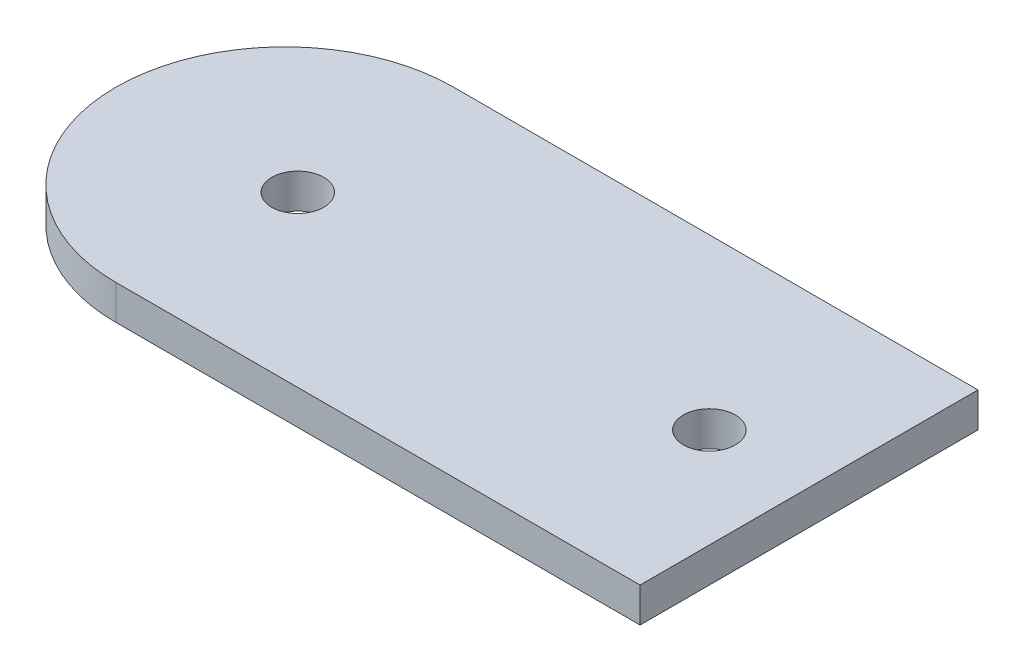
ISO-10303-21;
HEADER;
FILE_DESCRIPTION(('STEP AP214'),'2;1');
FILE_NAME('part.step','',(''),(''),'','','');
FILE_SCHEMA(('AUTOMOTIVE_DESIGN { 1 0 10303 214 1 1 1 1 }'));
ENDSEC;
DATA;
#1=APPLICATION_CONTEXT('core data for automotive mechanical design processes');
#2=APPLICATION_PROTOCOL_DEFINITION('international standard','automotive_design',2000,#1);
#3=PRODUCT_CONTEXT('',#1,'mechanical');
#4=PRODUCT('Part','Part','',(#3));
#5=PRODUCT_RELATED_PRODUCT_CATEGORY('part','',(#4));
#6=PRODUCT_DEFINITION_FORMATION('','',#4);
#7=PRODUCT_DEFINITION_CONTEXT('part definition',#1,'design');
#8=PRODUCT_DEFINITION('design','',#6,#7);
#9=PRODUCT_DEFINITION_SHAPE('','',#8);
#10=(LENGTH_UNIT() NAMED_UNIT(*) SI_UNIT(.MILLI.,.METRE.));
#11=(NAMED_UNIT(*) PLANE_ANGLE_UNIT() SI_UNIT($,.RADIAN.));
#12=(NAMED_UNIT(*) SI_UNIT($,.STERADIAN.) SOLID_ANGLE_UNIT());
#13=UNCERTAINTY_MEASURE_WITH_UNIT(LENGTH_MEASURE(1.E-05),#10,'distance_accuracy_value','');
#14=(GEOMETRIC_REPRESENTATION_CONTEXT(3) GLOBAL_UNCERTAINTY_ASSIGNED_CONTEXT((#13)) GLOBAL_UNIT_ASSIGNED_CONTEXT((#10,
#11,#12)) REPRESENTATION_CONTEXT('',''));
#15=CARTESIAN_POINT('',(0.,0.,0.));
#16=DIRECTION('',(0.,0.,1.));
#17=DIRECTION('',(1.,0.,0.));
#18=AXIS2_PLACEMENT_3D('',#15,#16,#17);
#19=CARTESIAN_POINT('',(0.,2.,9.75));
#20=DIRECTION('',(0.,0.,-1.));
#21=DIRECTION('',(-1.,0.,0.));
#22=AXIS2_PLACEMENT_3D('',#19,#20,#21);
#23=PLANE('',#22);
#24=DIRECTION('',(1.,0.,0.));
#25=VECTOR('',#24,1.);
#26=CARTESIAN_POINT('',(0.,2.,9.75));
#27=LINE('',#26,#25);
#28=CARTESIAN_POINT('',(-10.25,2.,9.75));
#29=VERTEX_POINT('',#28);
#30=CARTESIAN_POINT('',(20.,2.,9.75));
#31=VERTEX_POINT('',#30);
#32=EDGE_CURVE('E88',#29,#31,#27,.T.);
#33=ORIENTED_EDGE('',*,*,#32,.F.);
#34=DIRECTION('',(0.,-1.,0.));
#35=VECTOR('',#34,1.);
#36=CARTESIAN_POINT('',(-10.25,0.,9.75));
#37=LINE('',#36,#35);
#38=CARTESIAN_POINT('',(-10.25,0.,9.75));
#39=VERTEX_POINT('',#38);
#40=EDGE_CURVE('E11',#29,#39,#37,.T.);
#41=ORIENTED_EDGE('',*,*,#40,.T.);
#42=DIRECTION('',(1.,0.,0.));
#43=VECTOR('',#42,1.);
#44=CARTESIAN_POINT('',(0.,0.,9.75));
#45=LINE('',#44,#43);
#46=CARTESIAN_POINT('',(20.,0.,9.75));
#47=VERTEX_POINT('',#46);
#48=EDGE_CURVE('E110',#39,#47,#45,.T.);
#49=ORIENTED_EDGE('',*,*,#48,.T.);
#50=DIRECTION('',(0.,-1.,0.));
#51=VECTOR('',#50,1.);
#52=CARTESIAN_POINT('',(20.,2.,9.75));
#53=LINE('',#52,#51);
#54=EDGE_CURVE('E103',#31,#47,#53,.T.);
#55=ORIENTED_EDGE('',*,*,#54,.F.);
#56=EDGE_LOOP('',(#33,#41,#49,#55));
#57=FACE_BOUND('',#56,.T.);
#58=ADVANCED_FACE('F45',(#57),#23,.F.);
#59=CARTESIAN_POINT('',(20.,2.,0.));
#60=DIRECTION('',(-1.,0.,0.));
#61=DIRECTION('',(0.,0.,1.));
#62=AXIS2_PLACEMENT_3D('',#59,#60,#61);
#63=PLANE('',#62);
#64=DIRECTION('',(0.,0.,-1.));
#65=VECTOR('',#64,1.);
#66=CARTESIAN_POINT('',(20.,0.,0.));
#67=LINE('',#66,#65);
#68=CARTESIAN_POINT('',(20.,0.,-9.75));
#69=VERTEX_POINT('',#68);
#70=EDGE_CURVE('E151',#47,#69,#67,.T.);
#71=ORIENTED_EDGE('',*,*,#70,.T.);
#72=DIRECTION('',(0.,-1.,0.));
#73=VECTOR('',#72,1.);
#74=CARTESIAN_POINT('',(20.,2.,-9.75));
#75=LINE('',#74,#73);
#76=CARTESIAN_POINT('',(20.,2.,-9.75));
#77=VERTEX_POINT('',#76);
#78=EDGE_CURVE('E105',#77,#69,#75,.T.);
#79=ORIENTED_EDGE('',*,*,#78,.F.);
#80=DIRECTION('',(0.,0.,-1.));
#81=VECTOR('',#80,1.);
#82=CARTESIAN_POINT('',(20.,2.,0.));
#83=LINE('',#82,#81);
#84=EDGE_CURVE('E91',#31,#77,#83,.T.);
#85=ORIENTED_EDGE('',*,*,#84,.F.);
#86=ORIENTED_EDGE('',*,*,#54,.T.);
#87=EDGE_LOOP('',(#71,#79,#85,#86));
#88=FACE_BOUND('',#87,.T.);
#89=ADVANCED_FACE('F102',(#88),#63,.F.);
#90=CARTESIAN_POINT('',(0.,2.,-9.75));
#91=DIRECTION('',(0.,0.,-1.));
#92=DIRECTION('',(-1.,0.,0.));
#93=AXIS2_PLACEMENT_3D('',#90,#91,#92);
#94=PLANE('',#93);
#95=DIRECTION('',(1.,0.,0.));
#96=VECTOR('',#95,1.);
#97=CARTESIAN_POINT('',(0.,0.,-9.75));
#98=LINE('',#97,#96);
#99=CARTESIAN_POINT('',(-10.25,0.,-9.75));
#100=VERTEX_POINT('',#99);
#101=EDGE_CURVE('E135',#100,#69,#98,.T.);
#102=ORIENTED_EDGE('',*,*,#101,.F.);
#103=DIRECTION('',(0.,-1.,0.));
#104=VECTOR('',#103,1.);
#105=CARTESIAN_POINT('',(-10.25,2.,-9.75));
#106=LINE('',#105,#104);
#107=CARTESIAN_POINT('',(-10.25,2.,-9.75));
#108=VERTEX_POINT('',#107);
#109=EDGE_CURVE('E124',#100,#108,#106,.F.);
#110=ORIENTED_EDGE('',*,*,#109,.T.);
#111=DIRECTION('',(1.,0.,0.));
#112=VECTOR('',#111,1.);
#113=CARTESIAN_POINT('',(0.,2.,-9.75));
#114=LINE('',#113,#112);
#115=EDGE_CURVE('E107',#108,#77,#114,.T.);
#116=ORIENTED_EDGE('',*,*,#115,.T.);
#117=ORIENTED_EDGE('',*,*,#78,.T.);
#118=EDGE_LOOP('',(#102,#110,#116,#117));
#119=FACE_BOUND('',#118,.T.);
#120=ADVANCED_FACE('F134',(#119),#94,.T.);
#121=CARTESIAN_POINT('',(-9.5,2.,0.));
#122=DIRECTION('',(0.,-1.,0.));
#123=DIRECTION('',(0.,0.,-1.));
#124=AXIS2_PLACEMENT_3D('',#121,#122,#123);
#125=CYLINDRICAL_SURFACE('',#124,1.5);
#126=CARTESIAN_POINT('',(-9.5,2.,0.));
#127=DIRECTION('',(0.,1.,0.));
#128=DIRECTION('',(0.,0.,1.));
#129=AXIS2_PLACEMENT_3D('',#126,#127,#128);
#130=CIRCLE('',#129,1.5);
#131=CARTESIAN_POINT('',(-9.5,2.,1.5));
#132=VERTEX_POINT('',#131);
#133=EDGE_CURVE('E97',#132,#132,#130,.T.);
#134=ORIENTED_EDGE('',*,*,#133,.T.);
#135=EDGE_LOOP('',(#134));
#136=FACE_BOUND('',#135,.T.);
#137=CARTESIAN_POINT('',(-9.5,0.,0.));
#138=DIRECTION('',(0.,1.,0.));
#139=DIRECTION('',(0.,0.,1.));
#140=AXIS2_PLACEMENT_3D('',#137,#138,#139);
#141=CIRCLE('',#140,1.5);
#142=CARTESIAN_POINT('',(-9.5,0.,1.5));
#143=VERTEX_POINT('',#142);
#144=EDGE_CURVE('E145',#143,#143,#141,.T.);
#145=ORIENTED_EDGE('',*,*,#144,.F.);
#146=EDGE_LOOP('',(#145));
#147=FACE_BOUND('',#146,.T.);
#148=ADVANCED_FACE('F166',(#136,#147),#125,.F.);
#149=CARTESIAN_POINT('',(14.25,2.,0.));
#150=DIRECTION('',(0.,-1.,0.));
#151=DIRECTION('',(0.,0.,-1.));
#152=AXIS2_PLACEMENT_3D('',#149,#150,#151);
#153=CYLINDRICAL_SURFACE('',#152,1.5);
#154=CARTESIAN_POINT('',(14.25,2.,0.));
#155=DIRECTION('',(0.,1.,0.));
#156=DIRECTION('',(0.,0.,1.));
#157=AXIS2_PLACEMENT_3D('',#154,#155,#156);
#158=CIRCLE('',#157,1.5);
#159=CARTESIAN_POINT('',(14.25,2.,1.5));
#160=VERTEX_POINT('',#159);
#161=EDGE_CURVE('E154',#160,#160,#158,.T.);
#162=ORIENTED_EDGE('',*,*,#161,.T.);
#163=EDGE_LOOP('',(#162));
#164=FACE_BOUND('',#163,.T.);
#165=CARTESIAN_POINT('',(14.25,0.,0.));
#166=DIRECTION('',(0.,1.,0.));
#167=DIRECTION('',(0.,0.,1.));
#168=AXIS2_PLACEMENT_3D('',#165,#166,#167);
#169=CIRCLE('',#168,1.5);
#170=CARTESIAN_POINT('',(14.25,0.,1.5));
#171=VERTEX_POINT('',#170);
#172=EDGE_CURVE('E141',#171,#171,#169,.T.);
#173=ORIENTED_EDGE('',*,*,#172,.F.);
#174=EDGE_LOOP('',(#173));
#175=FACE_BOUND('',#174,.T.);
#176=ADVANCED_FACE('F171',(#164,#175),#153,.F.);
#177=CARTESIAN_POINT('',(0.,2.,0.));
#178=DIRECTION('',(0.,1.,0.));
#179=DIRECTION('',(0.,0.,1.));
#180=AXIS2_PLACEMENT_3D('',#177,#178,#179);
#181=PLANE('',#180);
#182=ORIENTED_EDGE('',*,*,#161,.F.);
#183=EDGE_LOOP('',(#182));
#184=FACE_BOUND('',#183,.T.);
#185=ORIENTED_EDGE('',*,*,#133,.F.);
#186=EDGE_LOOP('',(#185));
#187=FACE_BOUND('',#186,.T.);
#188=ORIENTED_EDGE('',*,*,#115,.F.);
#189=CARTESIAN_POINT('',(-10.25,2.,0.));
#190=DIRECTION('',(0.,1.,0.));
#191=DIRECTION('',(0.,0.,1.));
#192=AXIS2_PLACEMENT_3D('',#189,#190,#191);
#193=CIRCLE('',#192,9.75);
#194=CARTESIAN_POINT('',(-20.,2.,0.));
#195=VERTEX_POINT('',#194);
#196=EDGE_CURVE('E55',#108,#195,#193,.T.);
#197=ORIENTED_EDGE('',*,*,#196,.T.);
#198=CARTESIAN_POINT('',(-10.25,2.,0.));
#199=DIRECTION('',(0.,1.,0.));
#200=DIRECTION('',(0.,0.,1.));
#201=AXIS2_PLACEMENT_3D('',#198,#199,#200);
#202=CIRCLE('',#201,9.75);
#203=EDGE_CURVE('E65',#195,#29,#202,.T.);
#204=ORIENTED_EDGE('',*,*,#203,.T.);
#205=ORIENTED_EDGE('',*,*,#32,.T.);
#206=ORIENTED_EDGE('',*,*,#84,.T.);
#207=EDGE_LOOP('',(#188,#197,#204,#205,#206));
#208=FACE_BOUND('',#207,.T.);
#209=ADVANCED_FACE('F90',(#184,#187,#208),#181,.T.);
#210=CARTESIAN_POINT('',(0.,0.,0.));
#211=DIRECTION('',(0.,1.,0.));
#212=DIRECTION('',(0.,0.,1.));
#213=AXIS2_PLACEMENT_3D('',#210,#211,#212);
#214=PLANE('',#213);
#215=ORIENTED_EDGE('',*,*,#172,.T.);
#216=EDGE_LOOP('',(#215));
#217=FACE_BOUND('',#216,.T.);
#218=ORIENTED_EDGE('',*,*,#144,.T.);
#219=EDGE_LOOP('',(#218));
#220=FACE_BOUND('',#219,.T.);
#221=CARTESIAN_POINT('',(-10.25,0.,0.));
#222=DIRECTION('',(0.,1.,0.));
#223=DIRECTION('',(0.,0.,1.));
#224=AXIS2_PLACEMENT_3D('',#221,#222,#223);
#225=CIRCLE('',#224,9.75);
#226=CARTESIAN_POINT('',(-20.,0.,0.));
#227=VERTEX_POINT('',#226);
#228=EDGE_CURVE('E113',#39,#227,#225,.F.);
#229=ORIENTED_EDGE('',*,*,#228,.T.);
#230=CARTESIAN_POINT('',(-10.25,0.,0.));
#231=DIRECTION('',(0.,1.,0.));
#232=DIRECTION('',(0.,0.,1.));
#233=AXIS2_PLACEMENT_3D('',#230,#231,#232);
#234=CIRCLE('',#233,9.75);
#235=EDGE_CURVE('E117',#227,#100,#234,.F.);
#236=ORIENTED_EDGE('',*,*,#235,.T.);
#237=ORIENTED_EDGE('',*,*,#101,.T.);
#238=ORIENTED_EDGE('',*,*,#70,.F.);
#239=ORIENTED_EDGE('',*,*,#48,.F.);
#240=EDGE_LOOP('',(#229,#236,#237,#238,#239));
#241=FACE_BOUND('',#240,.T.);
#242=ADVANCED_FACE('F170',(#217,#220,#241),#214,.F.);
#243=CARTESIAN_POINT('',(-10.25,2.,0.));
#244=DIRECTION('',(0.,1.,0.));
#245=DIRECTION('',(0.,0.,1.));
#246=AXIS2_PLACEMENT_3D('',#243,#244,#245);
#247=CYLINDRICAL_SURFACE('',#246,9.75);
#248=ORIENTED_EDGE('',*,*,#40,.F.);
#249=ORIENTED_EDGE('',*,*,#203,.F.);
#250=DIRECTION('',(0.,-1.,0.));
#251=VECTOR('',#250,1.);
#252=CARTESIAN_POINT('',(-20.,2.,0.));
#253=LINE('',#252,#251);
#254=EDGE_CURVE('E49',#227,#195,#253,.F.);
#255=ORIENTED_EDGE('',*,*,#254,.F.);
#256=ORIENTED_EDGE('',*,*,#228,.F.);
#257=EDGE_LOOP('',(#248,#249,#255,#256));
#258=FACE_BOUND('',#257,.T.);
#259=ADVANCED_FACE('F47',(#258),#247,.T.);
#260=CARTESIAN_POINT('',(-10.25,2.,0.));
#261=DIRECTION('',(0.,-1.,0.));
#262=DIRECTION('',(0.,0.,-1.));
#263=AXIS2_PLACEMENT_3D('',#260,#261,#262);
#264=CYLINDRICAL_SURFACE('',#263,9.75);
#265=ORIENTED_EDGE('',*,*,#196,.F.);
#266=ORIENTED_EDGE('',*,*,#109,.F.);
#267=ORIENTED_EDGE('',*,*,#235,.F.);
#268=ORIENTED_EDGE('',*,*,#254,.T.);
#269=EDGE_LOOP('',(#265,#266,#267,#268));
#270=FACE_BOUND('',#269,.T.);
#271=ADVANCED_FACE('F190',(#270),#264,.T.);
#272=CLOSED_SHELL('',(#58,#89,#120,#148,#176,#209,#242,#259,#271));
#273=MANIFOLD_SOLID_BREP('B2',#272);
#274=ADVANCED_BREP_SHAPE_REPRESENTATION('',(#18,#273),#14);
#275=SHAPE_DEFINITION_REPRESENTATION(#9,#274);
ENDSEC;
END-ISO-10303-21;
